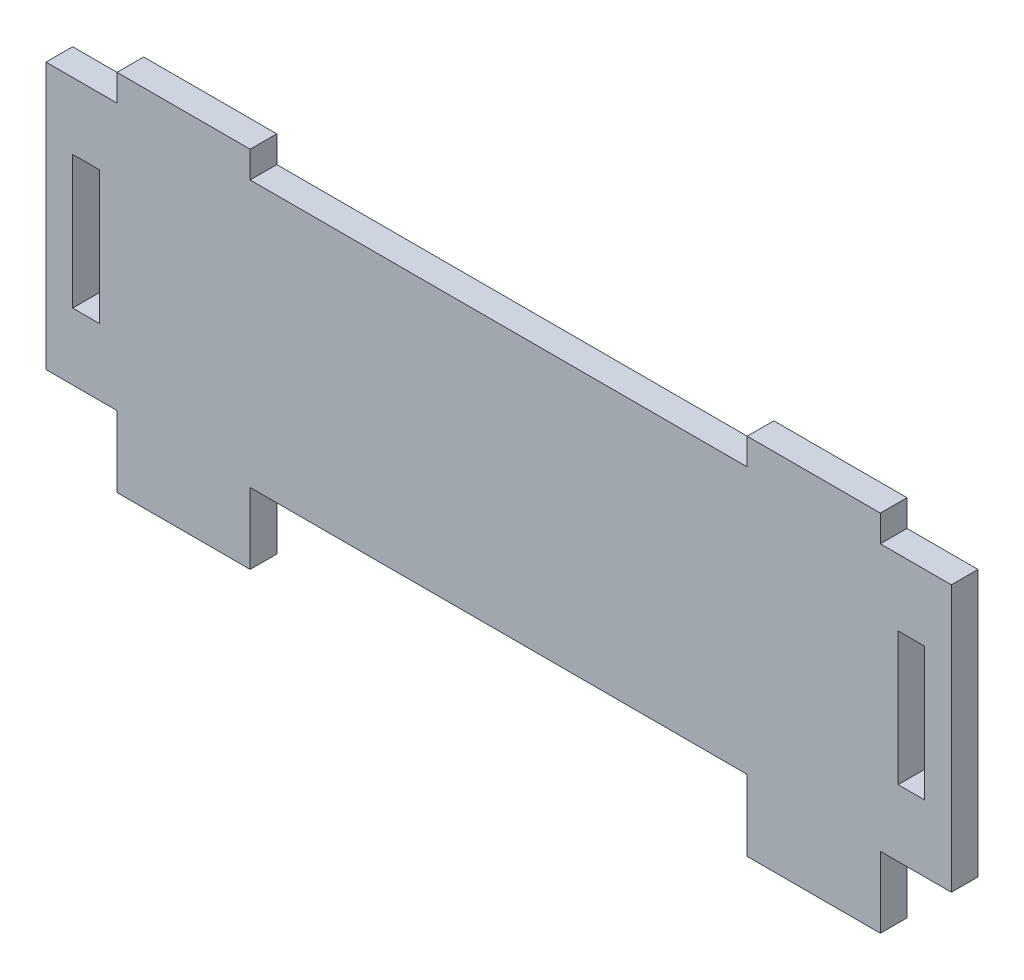
ISO-10303-21;
HEADER;
FILE_DESCRIPTION(('STEP AP214'),'2;1');
FILE_NAME('part.step','',(''),(''),'','','');
FILE_SCHEMA(('AUTOMOTIVE_DESIGN { 1 0 10303 214 1 1 1 1 }'));
ENDSEC;
DATA;
#1=APPLICATION_CONTEXT('core data for automotive mechanical design processes');
#2=APPLICATION_PROTOCOL_DEFINITION('international standard','automotive_design',2000,#1);
#3=PRODUCT_CONTEXT('',#1,'mechanical');
#4=PRODUCT('Part','Part','',(#3));
#5=PRODUCT_RELATED_PRODUCT_CATEGORY('part','',(#4));
#6=PRODUCT_DEFINITION_FORMATION('','',#4);
#7=PRODUCT_DEFINITION_CONTEXT('part definition',#1,'design');
#8=PRODUCT_DEFINITION('design','',#6,#7);
#9=PRODUCT_DEFINITION_SHAPE('','',#8);
#10=(LENGTH_UNIT() NAMED_UNIT(*) SI_UNIT(.MILLI.,.METRE.));
#11=(NAMED_UNIT(*) PLANE_ANGLE_UNIT() SI_UNIT($,.RADIAN.));
#12=(NAMED_UNIT(*) SI_UNIT($,.STERADIAN.) SOLID_ANGLE_UNIT());
#13=UNCERTAINTY_MEASURE_WITH_UNIT(LENGTH_MEASURE(1.E-05),#10,'distance_accuracy_value','');
#14=(GEOMETRIC_REPRESENTATION_CONTEXT(3) GLOBAL_UNCERTAINTY_ASSIGNED_CONTEXT((#13)) GLOBAL_UNIT_ASSIGNED_CONTEXT((#10,
#11,#12)) REPRESENTATION_CONTEXT('',''));
#15=CARTESIAN_POINT('',(0.,0.,0.));
#16=DIRECTION('',(0.,0.,1.));
#17=DIRECTION('',(1.,0.,0.));
#18=AXIS2_PLACEMENT_3D('',#15,#16,#17);
#19=CARTESIAN_POINT('',(-43.,-15.,3.));
#20=DIRECTION('',(0.,-1.,0.));
#21=DIRECTION('',(0.,0.,-1.));
#22=AXIS2_PLACEMENT_3D('',#19,#20,#21);
#23=PLANE('',#22);
#24=DIRECTION('',(-1.,0.,0.));
#25=VECTOR('',#24,1.);
#26=CARTESIAN_POINT('',(-43.,-15.,0.));
#27=LINE('',#26,#25);
#28=CARTESIAN_POINT('',(-43.,-15.,0.));
#29=VERTEX_POINT('',#28);
#30=CARTESIAN_POINT('',(-51.,-15.,0.));
#31=VERTEX_POINT('',#30);
#32=EDGE_CURVE('E420',#29,#31,#27,.T.);
#33=ORIENTED_EDGE('',*,*,#32,.F.);
#34=DIRECTION('',(0.,0.,-1.));
#35=VECTOR('',#34,1.);
#36=CARTESIAN_POINT('',(-43.,-15.,3.));
#37=LINE('',#36,#35);
#38=CARTESIAN_POINT('',(-43.,-15.,3.));
#39=VERTEX_POINT('',#38);
#40=EDGE_CURVE('E12',#39,#29,#37,.T.);
#41=ORIENTED_EDGE('',*,*,#40,.F.);
#42=DIRECTION('',(-1.,0.,0.));
#43=VECTOR('',#42,1.);
#44=CARTESIAN_POINT('',(-43.,-15.,3.));
#45=LINE('',#44,#43);
#46=CARTESIAN_POINT('',(-51.,-15.,3.));
#47=VERTEX_POINT('',#46);
#48=EDGE_CURVE('E427',#39,#47,#45,.T.);
#49=ORIENTED_EDGE('',*,*,#48,.T.);
#50=DIRECTION('',(0.,0.,-1.));
#51=VECTOR('',#50,1.);
#52=CARTESIAN_POINT('',(-51.,-15.,3.));
#53=LINE('',#52,#51);
#54=EDGE_CURVE('E179',#47,#31,#53,.T.);
#55=ORIENTED_EDGE('',*,*,#54,.T.);
#56=EDGE_LOOP('',(#33,#41,#49,#55));
#57=FACE_BOUND('',#56,.T.);
#58=ADVANCED_FACE('F176',(#57),#23,.T.);
#59=CARTESIAN_POINT('',(-43.,-23.,3.));
#60=DIRECTION('',(-1.,0.,0.));
#61=DIRECTION('',(0.,0.,1.));
#62=AXIS2_PLACEMENT_3D('',#59,#60,#61);
#63=PLANE('',#62);
#64=DIRECTION('',(0.,1.,0.));
#65=VECTOR('',#64,1.);
#66=CARTESIAN_POINT('',(-43.,-23.,0.));
#67=LINE('',#66,#65);
#68=CARTESIAN_POINT('',(-43.,-23.,0.));
#69=VERTEX_POINT('',#68);
#70=EDGE_CURVE('E431',#69,#29,#67,.T.);
#71=ORIENTED_EDGE('',*,*,#70,.F.);
#72=DIRECTION('',(0.,0.,-1.));
#73=VECTOR('',#72,1.);
#74=CARTESIAN_POINT('',(-43.,-23.,3.));
#75=LINE('',#74,#73);
#76=CARTESIAN_POINT('',(-43.,-23.,3.));
#77=VERTEX_POINT('',#76);
#78=EDGE_CURVE('E184',#77,#69,#75,.T.);
#79=ORIENTED_EDGE('',*,*,#78,.F.);
#80=DIRECTION('',(0.,1.,0.));
#81=VECTOR('',#80,1.);
#82=CARTESIAN_POINT('',(-43.,-23.,3.));
#83=LINE('',#82,#81);
#84=EDGE_CURVE('E483',#77,#39,#83,.T.);
#85=ORIENTED_EDGE('',*,*,#84,.T.);
#86=ORIENTED_EDGE('',*,*,#40,.T.);
#87=EDGE_LOOP('',(#71,#79,#85,#86));
#88=FACE_BOUND('',#87,.T.);
#89=ADVANCED_FACE('F590',(#88),#63,.T.);
#90=CARTESIAN_POINT('',(-43.,-23.,3.));
#91=DIRECTION('',(0.,1.,0.));
#92=DIRECTION('',(0.,0.,1.));
#93=AXIS2_PLACEMENT_3D('',#90,#91,#92);
#94=PLANE('',#93);
#95=DIRECTION('',(1.,0.,0.));
#96=VECTOR('',#95,1.);
#97=CARTESIAN_POINT('',(-43.,-23.,0.));
#98=LINE('',#97,#96);
#99=CARTESIAN_POINT('',(-28.,-23.,0.));
#100=VERTEX_POINT('',#99);
#101=EDGE_CURVE('E539',#69,#100,#98,.T.);
#102=ORIENTED_EDGE('',*,*,#101,.T.);
#103=DIRECTION('',(0.,0.,-1.));
#104=VECTOR('',#103,1.);
#105=CARTESIAN_POINT('',(-28.,-23.,3.));
#106=LINE('',#105,#104);
#107=CARTESIAN_POINT('',(-28.,-23.,3.));
#108=VERTEX_POINT('',#107);
#109=EDGE_CURVE('E545',#108,#100,#106,.T.);
#110=ORIENTED_EDGE('',*,*,#109,.F.);
#111=DIRECTION('',(1.,0.,0.));
#112=VECTOR('',#111,1.);
#113=CARTESIAN_POINT('',(-43.,-23.,3.));
#114=LINE('',#113,#112);
#115=EDGE_CURVE('E481',#77,#108,#114,.T.);
#116=ORIENTED_EDGE('',*,*,#115,.F.);
#117=ORIENTED_EDGE('',*,*,#78,.T.);
#118=EDGE_LOOP('',(#102,#110,#116,#117));
#119=FACE_BOUND('',#118,.T.);
#120=ADVANCED_FACE('F660',(#119),#94,.F.);
#121=CARTESIAN_POINT('',(-28.,-15.,3.));
#122=DIRECTION('',(1.,0.,0.));
#123=DIRECTION('',(0.,1.,0.));
#124=AXIS2_PLACEMENT_3D('',#121,#122,#123);
#125=PLANE('',#124);
#126=DIRECTION('',(0.,-1.,0.));
#127=VECTOR('',#126,1.);
#128=CARTESIAN_POINT('',(-28.,-15.,0.));
#129=LINE('',#128,#127);
#130=CARTESIAN_POINT('',(-28.,-15.,0.));
#131=VERTEX_POINT('',#130);
#132=EDGE_CURVE('E536',#131,#100,#129,.T.);
#133=ORIENTED_EDGE('',*,*,#132,.F.);
#134=DIRECTION('',(0.,0.,-1.));
#135=VECTOR('',#134,1.);
#136=CARTESIAN_POINT('',(-28.,-15.,3.));
#137=LINE('',#136,#135);
#138=CARTESIAN_POINT('',(-28.,-15.,3.));
#139=VERTEX_POINT('',#138);
#140=EDGE_CURVE('E547',#139,#131,#137,.T.);
#141=ORIENTED_EDGE('',*,*,#140,.F.);
#142=DIRECTION('',(0.,-1.,0.));
#143=VECTOR('',#142,1.);
#144=CARTESIAN_POINT('',(-28.,-15.,3.));
#145=LINE('',#144,#143);
#146=EDGE_CURVE('E478',#139,#108,#145,.T.);
#147=ORIENTED_EDGE('',*,*,#146,.T.);
#148=ORIENTED_EDGE('',*,*,#109,.T.);
#149=EDGE_LOOP('',(#133,#141,#147,#148));
#150=FACE_BOUND('',#149,.T.);
#151=ADVANCED_FACE('F656',(#150),#125,.T.);
#152=CARTESIAN_POINT('',(28.,-15.,3.));
#153=DIRECTION('',(0.,-1.,0.));
#154=DIRECTION('',(1.,0.,0.));
#155=AXIS2_PLACEMENT_3D('',#152,#153,#154);
#156=PLANE('',#155);
#157=DIRECTION('',(-1.,0.,0.));
#158=VECTOR('',#157,1.);
#159=CARTESIAN_POINT('',(28.,-15.,0.));
#160=LINE('',#159,#158);
#161=CARTESIAN_POINT('',(28.,-15.,0.));
#162=VERTEX_POINT('',#161);
#163=EDGE_CURVE('E533',#162,#131,#160,.T.);
#164=ORIENTED_EDGE('',*,*,#163,.F.);
#165=DIRECTION('',(0.,0.,-1.));
#166=VECTOR('',#165,1.);
#167=CARTESIAN_POINT('',(28.,-15.,3.));
#168=LINE('',#167,#166);
#169=CARTESIAN_POINT('',(28.,-15.,3.));
#170=VERTEX_POINT('',#169);
#171=EDGE_CURVE('E549',#170,#162,#168,.T.);
#172=ORIENTED_EDGE('',*,*,#171,.F.);
#173=DIRECTION('',(-1.,0.,0.));
#174=VECTOR('',#173,1.);
#175=CARTESIAN_POINT('',(28.,-15.,3.));
#176=LINE('',#175,#174);
#177=EDGE_CURVE('E475',#170,#139,#176,.T.);
#178=ORIENTED_EDGE('',*,*,#177,.T.);
#179=ORIENTED_EDGE('',*,*,#140,.T.);
#180=EDGE_LOOP('',(#164,#172,#178,#179));
#181=FACE_BOUND('',#180,.T.);
#182=ADVANCED_FACE('F653',(#181),#156,.T.);
#183=CARTESIAN_POINT('',(28.,-23.,3.));
#184=DIRECTION('',(-1.,0.,0.));
#185=DIRECTION('',(0.,0.,1.));
#186=AXIS2_PLACEMENT_3D('',#183,#184,#185);
#187=PLANE('',#186);
#188=DIRECTION('',(0.,1.,0.));
#189=VECTOR('',#188,1.);
#190=CARTESIAN_POINT('',(28.,-23.,0.));
#191=LINE('',#190,#189);
#192=CARTESIAN_POINT('',(28.,-23.,0.));
#193=VERTEX_POINT('',#192);
#194=EDGE_CURVE('E530',#193,#162,#191,.T.);
#195=ORIENTED_EDGE('',*,*,#194,.F.);
#196=DIRECTION('',(0.,0.,-1.));
#197=VECTOR('',#196,1.);
#198=CARTESIAN_POINT('',(28.,-23.,3.));
#199=LINE('',#198,#197);
#200=CARTESIAN_POINT('',(28.,-23.,3.));
#201=VERTEX_POINT('',#200);
#202=EDGE_CURVE('E551',#201,#193,#199,.T.);
#203=ORIENTED_EDGE('',*,*,#202,.F.);
#204=DIRECTION('',(0.,1.,0.));
#205=VECTOR('',#204,1.);
#206=CARTESIAN_POINT('',(28.,-23.,3.));
#207=LINE('',#206,#205);
#208=EDGE_CURVE('E472',#201,#170,#207,.T.);
#209=ORIENTED_EDGE('',*,*,#208,.T.);
#210=ORIENTED_EDGE('',*,*,#171,.T.);
#211=EDGE_LOOP('',(#195,#203,#209,#210));
#212=FACE_BOUND('',#211,.T.);
#213=ADVANCED_FACE('F649',(#212),#187,.T.);
#214=CARTESIAN_POINT('',(43.,-23.,3.));
#215=DIRECTION('',(0.,-1.,0.));
#216=DIRECTION('',(0.,0.,-1.));
#217=AXIS2_PLACEMENT_3D('',#214,#215,#216);
#218=PLANE('',#217);
#219=DIRECTION('',(-1.,0.,0.));
#220=VECTOR('',#219,1.);
#221=CARTESIAN_POINT('',(43.,-23.,0.));
#222=LINE('',#221,#220);
#223=CARTESIAN_POINT('',(43.,-23.,0.));
#224=VERTEX_POINT('',#223);
#225=EDGE_CURVE('E527',#224,#193,#222,.T.);
#226=ORIENTED_EDGE('',*,*,#225,.F.);
#227=DIRECTION('',(0.,0.,-1.));
#228=VECTOR('',#227,1.);
#229=CARTESIAN_POINT('',(43.,-23.,3.));
#230=LINE('',#229,#228);
#231=CARTESIAN_POINT('',(43.,-23.,3.));
#232=VERTEX_POINT('',#231);
#233=EDGE_CURVE('E553',#232,#224,#230,.T.);
#234=ORIENTED_EDGE('',*,*,#233,.F.);
#235=DIRECTION('',(-1.,0.,0.));
#236=VECTOR('',#235,1.);
#237=CARTESIAN_POINT('',(43.,-23.,3.));
#238=LINE('',#237,#236);
#239=EDGE_CURVE('E469',#232,#201,#238,.T.);
#240=ORIENTED_EDGE('',*,*,#239,.T.);
#241=ORIENTED_EDGE('',*,*,#202,.T.);
#242=EDGE_LOOP('',(#226,#234,#240,#241));
#243=FACE_BOUND('',#242,.T.);
#244=ADVANCED_FACE('F645',(#243),#218,.T.);
#245=CARTESIAN_POINT('',(43.,-15.,3.));
#246=DIRECTION('',(1.,0.,0.));
#247=DIRECTION('',(0.,0.,-1.));
#248=AXIS2_PLACEMENT_3D('',#245,#246,#247);
#249=PLANE('',#248);
#250=DIRECTION('',(0.,-1.,0.));
#251=VECTOR('',#250,1.);
#252=CARTESIAN_POINT('',(43.,-15.,0.));
#253=LINE('',#252,#251);
#254=CARTESIAN_POINT('',(43.,-15.,0.));
#255=VERTEX_POINT('',#254);
#256=EDGE_CURVE('E524',#255,#224,#253,.T.);
#257=ORIENTED_EDGE('',*,*,#256,.F.);
#258=DIRECTION('',(0.,0.,-1.));
#259=VECTOR('',#258,1.);
#260=CARTESIAN_POINT('',(43.,-15.,3.));
#261=LINE('',#260,#259);
#262=CARTESIAN_POINT('',(43.,-15.,3.));
#263=VERTEX_POINT('',#262);
#264=EDGE_CURVE('E555',#263,#255,#261,.T.);
#265=ORIENTED_EDGE('',*,*,#264,.F.);
#266=DIRECTION('',(0.,-1.,0.));
#267=VECTOR('',#266,1.);
#268=CARTESIAN_POINT('',(43.,-15.,3.));
#269=LINE('',#268,#267);
#270=EDGE_CURVE('E466',#263,#232,#269,.T.);
#271=ORIENTED_EDGE('',*,*,#270,.T.);
#272=ORIENTED_EDGE('',*,*,#233,.T.);
#273=EDGE_LOOP('',(#257,#265,#271,#272));
#274=FACE_BOUND('',#273,.T.);
#275=ADVANCED_FACE('F641',(#274),#249,.T.);
#276=CARTESIAN_POINT('',(51.,-15.,3.));
#277=DIRECTION('',(0.,-1.,0.));
#278=DIRECTION('',(1.,0.,0.));
#279=AXIS2_PLACEMENT_3D('',#276,#277,#278);
#280=PLANE('',#279);
#281=DIRECTION('',(-1.,0.,0.));
#282=VECTOR('',#281,1.);
#283=CARTESIAN_POINT('',(51.,-15.,0.));
#284=LINE('',#283,#282);
#285=CARTESIAN_POINT('',(51.,-15.,0.));
#286=VERTEX_POINT('',#285);
#287=EDGE_CURVE('E521',#286,#255,#284,.T.);
#288=ORIENTED_EDGE('',*,*,#287,.F.);
#289=DIRECTION('',(0.,0.,-1.));
#290=VECTOR('',#289,1.);
#291=CARTESIAN_POINT('',(51.,-15.,3.));
#292=LINE('',#291,#290);
#293=CARTESIAN_POINT('',(51.,-15.,3.));
#294=VERTEX_POINT('',#293);
#295=EDGE_CURVE('E557',#294,#286,#292,.T.);
#296=ORIENTED_EDGE('',*,*,#295,.F.);
#297=DIRECTION('',(-1.,0.,0.));
#298=VECTOR('',#297,1.);
#299=CARTESIAN_POINT('',(51.,-15.,3.));
#300=LINE('',#299,#298);
#301=EDGE_CURVE('E463',#294,#263,#300,.T.);
#302=ORIENTED_EDGE('',*,*,#301,.T.);
#303=ORIENTED_EDGE('',*,*,#264,.T.);
#304=EDGE_LOOP('',(#288,#296,#302,#303));
#305=FACE_BOUND('',#304,.T.);
#306=ADVANCED_FACE('F636',(#305),#280,.T.);
#307=CARTESIAN_POINT('',(51.,-15.,3.));
#308=DIRECTION('',(-1.,0.,0.));
#309=DIRECTION('',(0.,0.,1.));
#310=AXIS2_PLACEMENT_3D('',#307,#308,#309);
#311=PLANE('',#310);
#312=DIRECTION('',(0.,1.,0.));
#313=VECTOR('',#312,1.);
#314=CARTESIAN_POINT('',(51.,-15.,0.));
#315=LINE('',#314,#313);
#316=CARTESIAN_POINT('',(51.,15.,0.));
#317=VERTEX_POINT('',#316);
#318=EDGE_CURVE('E518',#286,#317,#315,.T.);
#319=ORIENTED_EDGE('',*,*,#318,.T.);
#320=DIRECTION('',(0.,0.,-1.));
#321=VECTOR('',#320,1.);
#322=CARTESIAN_POINT('',(51.,15.,3.));
#323=LINE('',#322,#321);
#324=CARTESIAN_POINT('',(51.,15.,3.));
#325=VERTEX_POINT('',#324);
#326=EDGE_CURVE('E559',#325,#317,#323,.T.);
#327=ORIENTED_EDGE('',*,*,#326,.F.);
#328=DIRECTION('',(0.,1.,0.));
#329=VECTOR('',#328,1.);
#330=CARTESIAN_POINT('',(51.,-15.,3.));
#331=LINE('',#330,#329);
#332=EDGE_CURVE('E461',#294,#325,#331,.T.);
#333=ORIENTED_EDGE('',*,*,#332,.F.);
#334=ORIENTED_EDGE('',*,*,#295,.T.);
#335=EDGE_LOOP('',(#319,#327,#333,#334));
#336=FACE_BOUND('',#335,.T.);
#337=ADVANCED_FACE('F633',(#336),#311,.F.);
#338=CARTESIAN_POINT('',(43.,15.,3.));
#339=DIRECTION('',(0.,1.,0.));
#340=DIRECTION('',(-1.,0.,0.));
#341=AXIS2_PLACEMENT_3D('',#338,#339,#340);
#342=PLANE('',#341);
#343=DIRECTION('',(1.,0.,0.));
#344=VECTOR('',#343,1.);
#345=CARTESIAN_POINT('',(43.,15.,0.));
#346=LINE('',#345,#344);
#347=CARTESIAN_POINT('',(43.,15.,0.));
#348=VERTEX_POINT('',#347);
#349=EDGE_CURVE('E515',#348,#317,#346,.T.);
#350=ORIENTED_EDGE('',*,*,#349,.F.);
#351=DIRECTION('',(0.,0.,-1.));
#352=VECTOR('',#351,1.);
#353=CARTESIAN_POINT('',(43.,15.,3.));
#354=LINE('',#353,#352);
#355=CARTESIAN_POINT('',(43.,15.,3.));
#356=VERTEX_POINT('',#355);
#357=EDGE_CURVE('E561',#356,#348,#354,.T.);
#358=ORIENTED_EDGE('',*,*,#357,.F.);
#359=DIRECTION('',(1.,0.,0.));
#360=VECTOR('',#359,1.);
#361=CARTESIAN_POINT('',(43.,15.,3.));
#362=LINE('',#361,#360);
#363=EDGE_CURVE('E458',#356,#325,#362,.T.);
#364=ORIENTED_EDGE('',*,*,#363,.T.);
#365=ORIENTED_EDGE('',*,*,#326,.T.);
#366=EDGE_LOOP('',(#350,#358,#364,#365));
#367=FACE_BOUND('',#366,.T.);
#368=ADVANCED_FACE('F629',(#367),#342,.T.);
#369=CARTESIAN_POINT('',(43.,18.,3.));
#370=DIRECTION('',(1.,0.,0.));
#371=DIRECTION('',(0.,0.,-1.));
#372=AXIS2_PLACEMENT_3D('',#369,#370,#371);
#373=PLANE('',#372);
#374=DIRECTION('',(0.,-1.,0.));
#375=VECTOR('',#374,1.);
#376=CARTESIAN_POINT('',(43.,18.,0.));
#377=LINE('',#376,#375);
#378=CARTESIAN_POINT('',(43.,18.,0.));
#379=VERTEX_POINT('',#378);
#380=EDGE_CURVE('E512',#379,#348,#377,.T.);
#381=ORIENTED_EDGE('',*,*,#380,.F.);
#382=DIRECTION('',(0.,0.,-1.));
#383=VECTOR('',#382,1.);
#384=CARTESIAN_POINT('',(43.,18.,3.));
#385=LINE('',#384,#383);
#386=CARTESIAN_POINT('',(43.,18.,3.));
#387=VERTEX_POINT('',#386);
#388=EDGE_CURVE('E563',#387,#379,#385,.T.);
#389=ORIENTED_EDGE('',*,*,#388,.F.);
#390=DIRECTION('',(0.,-1.,0.));
#391=VECTOR('',#390,1.);
#392=CARTESIAN_POINT('',(43.,18.,3.));
#393=LINE('',#392,#391);
#394=EDGE_CURVE('E455',#387,#356,#393,.T.);
#395=ORIENTED_EDGE('',*,*,#394,.T.);
#396=ORIENTED_EDGE('',*,*,#357,.T.);
#397=EDGE_LOOP('',(#381,#389,#395,#396));
#398=FACE_BOUND('',#397,.T.);
#399=ADVANCED_FACE('F625',(#398),#373,.T.);
#400=CARTESIAN_POINT('',(28.,18.,3.));
#401=DIRECTION('',(0.,1.,0.));
#402=DIRECTION('',(0.,0.,1.));
#403=AXIS2_PLACEMENT_3D('',#400,#401,#402);
#404=PLANE('',#403);
#405=DIRECTION('',(1.,0.,0.));
#406=VECTOR('',#405,1.);
#407=CARTESIAN_POINT('',(28.,18.,0.));
#408=LINE('',#407,#406);
#409=CARTESIAN_POINT('',(28.,18.,0.));
#410=VERTEX_POINT('',#409);
#411=EDGE_CURVE('E509',#410,#379,#408,.T.);
#412=ORIENTED_EDGE('',*,*,#411,.F.);
#413=DIRECTION('',(0.,0.,-1.));
#414=VECTOR('',#413,1.);
#415=CARTESIAN_POINT('',(28.,18.,3.));
#416=LINE('',#415,#414);
#417=CARTESIAN_POINT('',(28.,18.,3.));
#418=VERTEX_POINT('',#417);
#419=EDGE_CURVE('E565',#418,#410,#416,.T.);
#420=ORIENTED_EDGE('',*,*,#419,.F.);
#421=DIRECTION('',(1.,0.,0.));
#422=VECTOR('',#421,1.);
#423=CARTESIAN_POINT('',(28.,18.,3.));
#424=LINE('',#423,#422);
#425=EDGE_CURVE('E452',#418,#387,#424,.T.);
#426=ORIENTED_EDGE('',*,*,#425,.T.);
#427=ORIENTED_EDGE('',*,*,#388,.T.);
#428=EDGE_LOOP('',(#412,#420,#426,#427));
#429=FACE_BOUND('',#428,.T.);
#430=ADVANCED_FACE('F620',(#429),#404,.T.);
#431=CARTESIAN_POINT('',(28.,15.,3.));
#432=DIRECTION('',(-1.,0.,0.));
#433=DIRECTION('',(0.,0.,1.));
#434=AXIS2_PLACEMENT_3D('',#431,#432,#433);
#435=PLANE('',#434);
#436=DIRECTION('',(0.,1.,0.));
#437=VECTOR('',#436,1.);
#438=CARTESIAN_POINT('',(28.,15.,0.));
#439=LINE('',#438,#437);
#440=CARTESIAN_POINT('',(28.,15.,0.));
#441=VERTEX_POINT('',#440);
#442=EDGE_CURVE('E506',#441,#410,#439,.T.);
#443=ORIENTED_EDGE('',*,*,#442,.F.);
#444=DIRECTION('',(0.,0.,-1.));
#445=VECTOR('',#444,1.);
#446=CARTESIAN_POINT('',(28.,15.,3.));
#447=LINE('',#446,#445);
#448=CARTESIAN_POINT('',(28.,15.,3.));
#449=VERTEX_POINT('',#448);
#450=EDGE_CURVE('E567',#449,#441,#447,.T.);
#451=ORIENTED_EDGE('',*,*,#450,.F.);
#452=DIRECTION('',(0.,1.,0.));
#453=VECTOR('',#452,1.);
#454=CARTESIAN_POINT('',(28.,15.,3.));
#455=LINE('',#454,#453);
#456=EDGE_CURVE('E449',#449,#418,#455,.T.);
#457=ORIENTED_EDGE('',*,*,#456,.T.);
#458=ORIENTED_EDGE('',*,*,#419,.T.);
#459=EDGE_LOOP('',(#443,#451,#457,#458));
#460=FACE_BOUND('',#459,.T.);
#461=ADVANCED_FACE('F616',(#460),#435,.T.);
#462=CARTESIAN_POINT('',(-28.,15.,3.));
#463=DIRECTION('',(0.,1.,0.));
#464=DIRECTION('',(0.,0.,1.));
#465=AXIS2_PLACEMENT_3D('',#462,#463,#464);
#466=PLANE('',#465);
#467=DIRECTION('',(1.,0.,0.));
#468=VECTOR('',#467,1.);
#469=CARTESIAN_POINT('',(-28.,15.,0.));
#470=LINE('',#469,#468);
#471=CARTESIAN_POINT('',(-28.,15.,0.));
#472=VERTEX_POINT('',#471);
#473=EDGE_CURVE('E503',#472,#441,#470,.T.);
#474=ORIENTED_EDGE('',*,*,#473,.F.);
#475=DIRECTION('',(0.,0.,-1.));
#476=VECTOR('',#475,1.);
#477=CARTESIAN_POINT('',(-28.,15.,3.));
#478=LINE('',#477,#476);
#479=CARTESIAN_POINT('',(-28.,15.,3.));
#480=VERTEX_POINT('',#479);
#481=EDGE_CURVE('E569',#480,#472,#478,.T.);
#482=ORIENTED_EDGE('',*,*,#481,.F.);
#483=DIRECTION('',(1.,0.,0.));
#484=VECTOR('',#483,1.);
#485=CARTESIAN_POINT('',(-28.,15.,3.));
#486=LINE('',#485,#484);
#487=EDGE_CURVE('E446',#480,#449,#486,.T.);
#488=ORIENTED_EDGE('',*,*,#487,.T.);
#489=ORIENTED_EDGE('',*,*,#450,.T.);
#490=EDGE_LOOP('',(#474,#482,#488,#489));
#491=FACE_BOUND('',#490,.T.);
#492=ADVANCED_FACE('F612',(#491),#466,.T.);
#493=CARTESIAN_POINT('',(-28.,18.,3.));
#494=DIRECTION('',(1.,0.,0.));
#495=DIRECTION('',(0.,0.,-1.));
#496=AXIS2_PLACEMENT_3D('',#493,#494,#495);
#497=PLANE('',#496);
#498=DIRECTION('',(0.,-1.,0.));
#499=VECTOR('',#498,1.);
#500=CARTESIAN_POINT('',(-28.,18.,0.));
#501=LINE('',#500,#499);
#502=CARTESIAN_POINT('',(-28.,18.,0.));
#503=VERTEX_POINT('',#502);
#504=EDGE_CURVE('E500',#503,#472,#501,.T.);
#505=ORIENTED_EDGE('',*,*,#504,.F.);
#506=DIRECTION('',(0.,0.,-1.));
#507=VECTOR('',#506,1.);
#508=CARTESIAN_POINT('',(-28.,18.,3.));
#509=LINE('',#508,#507);
#510=CARTESIAN_POINT('',(-28.,18.,3.));
#511=VERTEX_POINT('',#510);
#512=EDGE_CURVE('E571',#511,#503,#509,.T.);
#513=ORIENTED_EDGE('',*,*,#512,.F.);
#514=DIRECTION('',(0.,-1.,0.));
#515=VECTOR('',#514,1.);
#516=CARTESIAN_POINT('',(-28.,18.,3.));
#517=LINE('',#516,#515);
#518=EDGE_CURVE('E443',#511,#480,#517,.T.);
#519=ORIENTED_EDGE('',*,*,#518,.T.);
#520=ORIENTED_EDGE('',*,*,#481,.T.);
#521=EDGE_LOOP('',(#505,#513,#519,#520));
#522=FACE_BOUND('',#521,.T.);
#523=ADVANCED_FACE('F608',(#522),#497,.T.);
#524=CARTESIAN_POINT('',(-43.,18.,3.));
#525=DIRECTION('',(0.,1.,0.));
#526=DIRECTION('',(0.,0.,1.));
#527=AXIS2_PLACEMENT_3D('',#524,#525,#526);
#528=PLANE('',#527);
#529=DIRECTION('',(1.,0.,0.));
#530=VECTOR('',#529,1.);
#531=CARTESIAN_POINT('',(-43.,18.,0.));
#532=LINE('',#531,#530);
#533=CARTESIAN_POINT('',(-43.,18.,0.));
#534=VERTEX_POINT('',#533);
#535=EDGE_CURVE('E497',#534,#503,#532,.T.);
#536=ORIENTED_EDGE('',*,*,#535,.F.);
#537=DIRECTION('',(0.,0.,-1.));
#538=VECTOR('',#537,1.);
#539=CARTESIAN_POINT('',(-43.,18.,3.));
#540=LINE('',#539,#538);
#541=CARTESIAN_POINT('',(-43.,18.,3.));
#542=VERTEX_POINT('',#541);
#543=EDGE_CURVE('E573',#542,#534,#540,.T.);
#544=ORIENTED_EDGE('',*,*,#543,.F.);
#545=DIRECTION('',(1.,0.,0.));
#546=VECTOR('',#545,1.);
#547=CARTESIAN_POINT('',(-43.,18.,3.));
#548=LINE('',#547,#546);
#549=EDGE_CURVE('E440',#542,#511,#548,.T.);
#550=ORIENTED_EDGE('',*,*,#549,.T.);
#551=ORIENTED_EDGE('',*,*,#512,.T.);
#552=EDGE_LOOP('',(#536,#544,#550,#551));
#553=FACE_BOUND('',#552,.T.);
#554=ADVANCED_FACE('F604',(#553),#528,.T.);
#555=CARTESIAN_POINT('',(-43.,15.,3.));
#556=DIRECTION('',(-1.,0.,0.));
#557=DIRECTION('',(0.,0.,1.));
#558=AXIS2_PLACEMENT_3D('',#555,#556,#557);
#559=PLANE('',#558);
#560=DIRECTION('',(0.,1.,0.));
#561=VECTOR('',#560,1.);
#562=CARTESIAN_POINT('',(-43.,15.,0.));
#563=LINE('',#562,#561);
#564=CARTESIAN_POINT('',(-43.,15.,0.));
#565=VERTEX_POINT('',#564);
#566=EDGE_CURVE('E494',#565,#534,#563,.T.);
#567=ORIENTED_EDGE('',*,*,#566,.F.);
#568=DIRECTION('',(0.,0.,-1.));
#569=VECTOR('',#568,1.);
#570=CARTESIAN_POINT('',(-43.,15.,3.));
#571=LINE('',#570,#569);
#572=CARTESIAN_POINT('',(-43.,15.,3.));
#573=VERTEX_POINT('',#572);
#574=EDGE_CURVE('E575',#573,#565,#571,.T.);
#575=ORIENTED_EDGE('',*,*,#574,.F.);
#576=DIRECTION('',(0.,1.,0.));
#577=VECTOR('',#576,1.);
#578=CARTESIAN_POINT('',(-43.,15.,3.));
#579=LINE('',#578,#577);
#580=EDGE_CURVE('E437',#573,#542,#579,.T.);
#581=ORIENTED_EDGE('',*,*,#580,.T.);
#582=ORIENTED_EDGE('',*,*,#543,.T.);
#583=EDGE_LOOP('',(#567,#575,#581,#582));
#584=FACE_BOUND('',#583,.T.);
#585=ADVANCED_FACE('F602',(#584),#559,.T.);
#586=CARTESIAN_POINT('',(-51.,15.,3.));
#587=DIRECTION('',(0.,1.,0.));
#588=DIRECTION('',(0.,0.,1.));
#589=AXIS2_PLACEMENT_3D('',#586,#587,#588);
#590=PLANE('',#589);
#591=DIRECTION('',(1.,0.,0.));
#592=VECTOR('',#591,1.);
#593=CARTESIAN_POINT('',(-51.,15.,0.));
#594=LINE('',#593,#592);
#595=CARTESIAN_POINT('',(-51.,15.,0.));
#596=VERTEX_POINT('',#595);
#597=EDGE_CURVE('E491',#596,#565,#594,.T.);
#598=ORIENTED_EDGE('',*,*,#597,.F.);
#599=DIRECTION('',(0.,0.,-1.));
#600=VECTOR('',#599,1.);
#601=CARTESIAN_POINT('',(-51.,15.,3.));
#602=LINE('',#601,#600);
#603=CARTESIAN_POINT('',(-51.,15.,3.));
#604=VERTEX_POINT('',#603);
#605=EDGE_CURVE('E576',#604,#596,#602,.T.);
#606=ORIENTED_EDGE('',*,*,#605,.F.);
#607=DIRECTION('',(1.,0.,0.));
#608=VECTOR('',#607,1.);
#609=CARTESIAN_POINT('',(-51.,15.,3.));
#610=LINE('',#609,#608);
#611=EDGE_CURVE('E434',#604,#573,#610,.T.);
#612=ORIENTED_EDGE('',*,*,#611,.T.);
#613=ORIENTED_EDGE('',*,*,#574,.T.);
#614=EDGE_LOOP('',(#598,#606,#612,#613));
#615=FACE_BOUND('',#614,.T.);
#616=ADVANCED_FACE('F598',(#615),#590,.T.);
#617=CARTESIAN_POINT('',(-51.,-15.,3.));
#618=DIRECTION('',(-1.,0.,0.));
#619=DIRECTION('',(0.,0.,1.));
#620=AXIS2_PLACEMENT_3D('',#617,#618,#619);
#621=PLANE('',#620);
#622=DIRECTION('',(0.,1.,0.));
#623=VECTOR('',#622,1.);
#624=CARTESIAN_POINT('',(-51.,-15.,0.));
#625=LINE('',#624,#623);
#626=EDGE_CURVE('E488',#31,#596,#625,.T.);
#627=ORIENTED_EDGE('',*,*,#626,.F.);
#628=ORIENTED_EDGE('',*,*,#54,.F.);
#629=DIRECTION('',(0.,1.,0.));
#630=VECTOR('',#629,1.);
#631=CARTESIAN_POINT('',(-51.,-15.,3.));
#632=LINE('',#631,#630);
#633=EDGE_CURVE('E430',#47,#604,#632,.T.);
#634=ORIENTED_EDGE('',*,*,#633,.T.);
#635=ORIENTED_EDGE('',*,*,#605,.T.);
#636=EDGE_LOOP('',(#627,#628,#634,#635));
#637=FACE_BOUND('',#636,.T.);
#638=ADVANCED_FACE('F584',(#637),#621,.T.);
#639=CARTESIAN_POINT('',(0.,0.,3.));
#640=DIRECTION('',(0.,0.,-1.));
#641=DIRECTION('',(-1.,0.,0.));
#642=AXIS2_PLACEMENT_3D('',#639,#640,#641);
#643=PLANE('',#642);
#644=DIRECTION('',(0.,-1.,0.));
#645=VECTOR('',#644,1.);
#646=CARTESIAN_POINT('',(45.,7.5,3.));
#647=LINE('',#646,#645);
#648=CARTESIAN_POINT('',(45.,7.5,3.));
#649=VERTEX_POINT('',#648);
#650=CARTESIAN_POINT('',(45.,-7.5,3.));
#651=VERTEX_POINT('',#650);
#652=EDGE_CURVE('E366',#649,#651,#647,.T.);
#653=ORIENTED_EDGE('',*,*,#652,.F.);
#654=DIRECTION('',(1.,0.,0.));
#655=VECTOR('',#654,1.);
#656=CARTESIAN_POINT('',(45.,7.5,3.));
#657=LINE('',#656,#655);
#658=CARTESIAN_POINT('',(48.,7.5,3.));
#659=VERTEX_POINT('',#658);
#660=EDGE_CURVE('E363',#649,#659,#657,.T.);
#661=ORIENTED_EDGE('',*,*,#660,.T.);
#662=DIRECTION('',(0.,-1.,0.));
#663=VECTOR('',#662,1.);
#664=CARTESIAN_POINT('',(48.,7.5,3.));
#665=LINE('',#664,#663);
#666=CARTESIAN_POINT('',(48.,-7.5,3.));
#667=VERTEX_POINT('',#666);
#668=EDGE_CURVE('E369',#659,#667,#665,.T.);
#669=ORIENTED_EDGE('',*,*,#668,.T.);
#670=DIRECTION('',(1.,0.,0.));
#671=VECTOR('',#670,1.);
#672=CARTESIAN_POINT('',(45.,-7.5,3.));
#673=LINE('',#672,#671);
#674=EDGE_CURVE('E373',#651,#667,#673,.T.);
#675=ORIENTED_EDGE('',*,*,#674,.F.);
#676=EDGE_LOOP('',(#653,#661,#669,#675));
#677=FACE_BOUND('',#676,.T.);
#678=DIRECTION('',(0.,-1.,0.));
#679=VECTOR('',#678,1.);
#680=CARTESIAN_POINT('',(-48.,7.5,3.));
#681=LINE('',#680,#679);
#682=CARTESIAN_POINT('',(-48.,7.5,3.));
#683=VERTEX_POINT('',#682);
#684=CARTESIAN_POINT('',(-48.,-7.5,3.));
#685=VERTEX_POINT('',#684);
#686=EDGE_CURVE('E406',#683,#685,#681,.T.);
#687=ORIENTED_EDGE('',*,*,#686,.F.);
#688=DIRECTION('',(1.,0.,0.));
#689=VECTOR('',#688,1.);
#690=CARTESIAN_POINT('',(-48.,7.5,3.));
#691=LINE('',#690,#689);
#692=CARTESIAN_POINT('',(-45.,7.5,3.));
#693=VERTEX_POINT('',#692);
#694=EDGE_CURVE('E396',#683,#693,#691,.T.);
#695=ORIENTED_EDGE('',*,*,#694,.T.);
#696=DIRECTION('',(0.,-1.,0.));
#697=VECTOR('',#696,1.);
#698=CARTESIAN_POINT('',(-45.,7.5,3.));
#699=LINE('',#698,#697);
#700=CARTESIAN_POINT('',(-45.,-7.5,3.));
#701=VERTEX_POINT('',#700);
#702=EDGE_CURVE('E399',#693,#701,#699,.T.);
#703=ORIENTED_EDGE('',*,*,#702,.T.);
#704=DIRECTION('',(1.,0.,0.));
#705=VECTOR('',#704,1.);
#706=CARTESIAN_POINT('',(-48.,-7.5,3.));
#707=LINE('',#706,#705);
#708=EDGE_CURVE('E403',#685,#701,#707,.T.);
#709=ORIENTED_EDGE('',*,*,#708,.F.);
#710=EDGE_LOOP('',(#687,#695,#703,#709));
#711=FACE_BOUND('',#710,.T.);
#712=ORIENTED_EDGE('',*,*,#48,.F.);
#713=ORIENTED_EDGE('',*,*,#84,.F.);
#714=ORIENTED_EDGE('',*,*,#115,.T.);
#715=ORIENTED_EDGE('',*,*,#146,.F.);
#716=ORIENTED_EDGE('',*,*,#177,.F.);
#717=ORIENTED_EDGE('',*,*,#208,.F.);
#718=ORIENTED_EDGE('',*,*,#239,.F.);
#719=ORIENTED_EDGE('',*,*,#270,.F.);
#720=ORIENTED_EDGE('',*,*,#301,.F.);
#721=ORIENTED_EDGE('',*,*,#332,.T.);
#722=ORIENTED_EDGE('',*,*,#363,.F.);
#723=ORIENTED_EDGE('',*,*,#394,.F.);
#724=ORIENTED_EDGE('',*,*,#425,.F.);
#725=ORIENTED_EDGE('',*,*,#456,.F.);
#726=ORIENTED_EDGE('',*,*,#487,.F.);
#727=ORIENTED_EDGE('',*,*,#518,.F.);
#728=ORIENTED_EDGE('',*,*,#549,.F.);
#729=ORIENTED_EDGE('',*,*,#580,.F.);
#730=ORIENTED_EDGE('',*,*,#611,.F.);
#731=ORIENTED_EDGE('',*,*,#633,.F.);
#732=EDGE_LOOP('',(#712,#713,#714,#715,#716,#717,#718,#719,#720,#721,#722,#723,#724,#725,#726,
#727,#728,#729,#730,#731));
#733=FACE_BOUND('',#732,.T.);
#734=ADVANCED_FACE('F375',(#677,#711,#733),#643,.F.);
#735=CARTESIAN_POINT('',(0.,0.,0.));
#736=DIRECTION('',(0.,0.,-1.));
#737=DIRECTION('',(-1.,0.,0.));
#738=AXIS2_PLACEMENT_3D('',#735,#736,#737);
#739=PLANE('',#738);
#740=DIRECTION('',(1.,0.,0.));
#741=VECTOR('',#740,1.);
#742=CARTESIAN_POINT('',(45.,7.5,0.));
#743=LINE('',#742,#741);
#744=CARTESIAN_POINT('',(45.,7.5,0.));
#745=VERTEX_POINT('',#744);
#746=CARTESIAN_POINT('',(48.,7.5,0.));
#747=VERTEX_POINT('',#746);
#748=EDGE_CURVE('E200',#745,#747,#743,.T.);
#749=ORIENTED_EDGE('',*,*,#748,.F.);
#750=DIRECTION('',(0.,-1.,0.));
#751=VECTOR('',#750,1.);
#752=CARTESIAN_POINT('',(45.,7.5,0.));
#753=LINE('',#752,#751);
#754=CARTESIAN_POINT('',(45.,-7.5,0.));
#755=VERTEX_POINT('',#754);
#756=EDGE_CURVE('E377',#745,#755,#753,.T.);
#757=ORIENTED_EDGE('',*,*,#756,.T.);
#758=DIRECTION('',(1.,0.,0.));
#759=VECTOR('',#758,1.);
#760=CARTESIAN_POINT('',(45.,-7.5,0.));
#761=LINE('',#760,#759);
#762=CARTESIAN_POINT('',(48.,-7.5,0.));
#763=VERTEX_POINT('',#762);
#764=EDGE_CURVE('E380',#755,#763,#761,.T.);
#765=ORIENTED_EDGE('',*,*,#764,.T.);
#766=DIRECTION('',(0.,-1.,0.));
#767=VECTOR('',#766,1.);
#768=CARTESIAN_POINT('',(48.,7.5,0.));
#769=LINE('',#768,#767);
#770=EDGE_CURVE('E386',#747,#763,#769,.T.);
#771=ORIENTED_EDGE('',*,*,#770,.F.);
#772=EDGE_LOOP('',(#749,#757,#765,#771));
#773=FACE_BOUND('',#772,.T.);
#774=DIRECTION('',(1.,0.,0.));
#775=VECTOR('',#774,1.);
#776=CARTESIAN_POINT('',(-48.,7.5,0.));
#777=LINE('',#776,#775);
#778=CARTESIAN_POINT('',(-48.,7.5,0.));
#779=VERTEX_POINT('',#778);
#780=CARTESIAN_POINT('',(-45.,7.5,0.));
#781=VERTEX_POINT('',#780);
#782=EDGE_CURVE('E392',#779,#781,#777,.T.);
#783=ORIENTED_EDGE('',*,*,#782,.F.);
#784=DIRECTION('',(0.,-1.,0.));
#785=VECTOR('',#784,1.);
#786=CARTESIAN_POINT('',(-48.,7.5,0.));
#787=LINE('',#786,#785);
#788=CARTESIAN_POINT('',(-48.,-7.5,0.));
#789=VERTEX_POINT('',#788);
#790=EDGE_CURVE('E400',#779,#789,#787,.T.);
#791=ORIENTED_EDGE('',*,*,#790,.T.);
#792=DIRECTION('',(1.,0.,0.));
#793=VECTOR('',#792,1.);
#794=CARTESIAN_POINT('',(-48.,-7.5,0.));
#795=LINE('',#794,#793);
#796=CARTESIAN_POINT('',(-45.,-7.5,0.));
#797=VERTEX_POINT('',#796);
#798=EDGE_CURVE('E413',#789,#797,#795,.T.);
#799=ORIENTED_EDGE('',*,*,#798,.T.);
#800=DIRECTION('',(0.,-1.,0.));
#801=VECTOR('',#800,1.);
#802=CARTESIAN_POINT('',(-45.,7.5,0.));
#803=LINE('',#802,#801);
#804=EDGE_CURVE('E410',#781,#797,#803,.T.);
#805=ORIENTED_EDGE('',*,*,#804,.F.);
#806=EDGE_LOOP('',(#783,#791,#799,#805));
#807=FACE_BOUND('',#806,.T.);
#808=ORIENTED_EDGE('',*,*,#32,.T.);
#809=ORIENTED_EDGE('',*,*,#626,.T.);
#810=ORIENTED_EDGE('',*,*,#597,.T.);
#811=ORIENTED_EDGE('',*,*,#566,.T.);
#812=ORIENTED_EDGE('',*,*,#535,.T.);
#813=ORIENTED_EDGE('',*,*,#504,.T.);
#814=ORIENTED_EDGE('',*,*,#473,.T.);
#815=ORIENTED_EDGE('',*,*,#442,.T.);
#816=ORIENTED_EDGE('',*,*,#411,.T.);
#817=ORIENTED_EDGE('',*,*,#380,.T.);
#818=ORIENTED_EDGE('',*,*,#349,.T.);
#819=ORIENTED_EDGE('',*,*,#318,.F.);
#820=ORIENTED_EDGE('',*,*,#287,.T.);
#821=ORIENTED_EDGE('',*,*,#256,.T.);
#822=ORIENTED_EDGE('',*,*,#225,.T.);
#823=ORIENTED_EDGE('',*,*,#194,.T.);
#824=ORIENTED_EDGE('',*,*,#163,.T.);
#825=ORIENTED_EDGE('',*,*,#132,.T.);
#826=ORIENTED_EDGE('',*,*,#101,.F.);
#827=ORIENTED_EDGE('',*,*,#70,.T.);
#828=EDGE_LOOP('',(#808,#809,#810,#811,#812,#813,#814,#815,#816,#817,#818,#819,#820,#821,#822,
#823,#824,#825,#826,#827));
#829=FACE_BOUND('',#828,.T.);
#830=ADVANCED_FACE('F586',(#773,#807,#829),#739,.T.);
#831=CARTESIAN_POINT('',(-48.,7.5,3.));
#832=DIRECTION('',(0.,1.,0.));
#833=DIRECTION('',(0.,0.,1.));
#834=AXIS2_PLACEMENT_3D('',#831,#832,#833);
#835=PLANE('',#834);
#836=ORIENTED_EDGE('',*,*,#782,.T.);
#837=DIRECTION('',(0.,0.,-1.));
#838=VECTOR('',#837,1.);
#839=CARTESIAN_POINT('',(-45.,7.5,3.));
#840=LINE('',#839,#838);
#841=EDGE_CURVE('E408',#693,#781,#840,.T.);
#842=ORIENTED_EDGE('',*,*,#841,.F.);
#843=ORIENTED_EDGE('',*,*,#694,.F.);
#844=DIRECTION('',(0.,0.,-1.));
#845=VECTOR('',#844,1.);
#846=CARTESIAN_POINT('',(-48.,7.5,3.));
#847=LINE('',#846,#845);
#848=EDGE_CURVE('E418',#683,#779,#847,.T.);
#849=ORIENTED_EDGE('',*,*,#848,.T.);
#850=EDGE_LOOP('',(#836,#842,#843,#849));
#851=FACE_BOUND('',#850,.T.);
#852=ADVANCED_FACE('F830',(#851),#835,.F.);
#853=CARTESIAN_POINT('',(-48.,7.5,3.));
#854=DIRECTION('',(1.,0.,0.));
#855=DIRECTION('',(0.,0.,-1.));
#856=AXIS2_PLACEMENT_3D('',#853,#854,#855);
#857=PLANE('',#856);
#858=ORIENTED_EDGE('',*,*,#790,.F.);
#859=ORIENTED_EDGE('',*,*,#848,.F.);
#860=ORIENTED_EDGE('',*,*,#686,.T.);
#861=DIRECTION('',(0.,0.,-1.));
#862=VECTOR('',#861,1.);
#863=CARTESIAN_POINT('',(-48.,-7.5,3.));
#864=LINE('',#863,#862);
#865=EDGE_CURVE('E421',#685,#789,#864,.T.);
#866=ORIENTED_EDGE('',*,*,#865,.T.);
#867=EDGE_LOOP('',(#858,#859,#860,#866));
#868=FACE_BOUND('',#867,.T.);
#869=ADVANCED_FACE('F840',(#868),#857,.T.);
#870=CARTESIAN_POINT('',(-48.,-7.5,3.));
#871=DIRECTION('',(0.,1.,0.));
#872=DIRECTION('',(0.,0.,1.));
#873=AXIS2_PLACEMENT_3D('',#870,#871,#872);
#874=PLANE('',#873);
#875=ORIENTED_EDGE('',*,*,#798,.F.);
#876=ORIENTED_EDGE('',*,*,#865,.F.);
#877=ORIENTED_EDGE('',*,*,#708,.T.);
#878=DIRECTION('',(0.,0.,-1.));
#879=VECTOR('',#878,1.);
#880=CARTESIAN_POINT('',(-45.,-7.5,3.));
#881=LINE('',#880,#879);
#882=EDGE_CURVE('E423',#701,#797,#881,.T.);
#883=ORIENTED_EDGE('',*,*,#882,.T.);
#884=EDGE_LOOP('',(#875,#876,#877,#883));
#885=FACE_BOUND('',#884,.T.);
#886=ADVANCED_FACE('F850',(#885),#874,.T.);
#887=CARTESIAN_POINT('',(-45.,7.5,3.));
#888=DIRECTION('',(1.,0.,0.));
#889=DIRECTION('',(0.,0.,-1.));
#890=AXIS2_PLACEMENT_3D('',#887,#888,#889);
#891=PLANE('',#890);
#892=ORIENTED_EDGE('',*,*,#804,.T.);
#893=ORIENTED_EDGE('',*,*,#882,.F.);
#894=ORIENTED_EDGE('',*,*,#702,.F.);
#895=ORIENTED_EDGE('',*,*,#841,.T.);
#896=EDGE_LOOP('',(#892,#893,#894,#895));
#897=FACE_BOUND('',#896,.T.);
#898=ADVANCED_FACE('F860',(#897),#891,.F.);
#899=CARTESIAN_POINT('',(45.,7.5,3.));
#900=DIRECTION('',(0.,1.,0.));
#901=DIRECTION('',(0.,0.,1.));
#902=AXIS2_PLACEMENT_3D('',#899,#900,#901);
#903=PLANE('',#902);
#904=ORIENTED_EDGE('',*,*,#748,.T.);
#905=DIRECTION('',(0.,0.,-1.));
#906=VECTOR('',#905,1.);
#907=CARTESIAN_POINT('',(48.,7.5,3.));
#908=LINE('',#907,#906);
#909=EDGE_CURVE('E360',#659,#747,#908,.T.);
#910=ORIENTED_EDGE('',*,*,#909,.F.);
#911=ORIENTED_EDGE('',*,*,#660,.F.);
#912=DIRECTION('',(0.,0.,-1.));
#913=VECTOR('',#912,1.);
#914=CARTESIAN_POINT('',(45.,7.5,3.));
#915=LINE('',#914,#913);
#916=EDGE_CURVE('E390',#649,#745,#915,.T.);
#917=ORIENTED_EDGE('',*,*,#916,.T.);
#918=EDGE_LOOP('',(#904,#910,#911,#917));
#919=FACE_BOUND('',#918,.T.);
#920=ADVANCED_FACE('F361',(#919),#903,.F.);
#921=CARTESIAN_POINT('',(45.,7.5,3.));
#922=DIRECTION('',(1.,0.,0.));
#923=DIRECTION('',(0.,0.,-1.));
#924=AXIS2_PLACEMENT_3D('',#921,#922,#923);
#925=PLANE('',#924);
#926=ORIENTED_EDGE('',*,*,#756,.F.);
#927=ORIENTED_EDGE('',*,*,#916,.F.);
#928=ORIENTED_EDGE('',*,*,#652,.T.);
#929=DIRECTION('',(0.,0.,-1.));
#930=VECTOR('',#929,1.);
#931=CARTESIAN_POINT('',(45.,-7.5,3.));
#932=LINE('',#931,#930);
#933=EDGE_CURVE('E393',#651,#755,#932,.T.);
#934=ORIENTED_EDGE('',*,*,#933,.T.);
#935=EDGE_LOOP('',(#926,#927,#928,#934));
#936=FACE_BOUND('',#935,.T.);
#937=ADVANCED_FACE('F879',(#936),#925,.T.);
#938=CARTESIAN_POINT('',(45.,-7.5,3.));
#939=DIRECTION('',(0.,1.,0.));
#940=DIRECTION('',(0.,0.,1.));
#941=AXIS2_PLACEMENT_3D('',#938,#939,#940);
#942=PLANE('',#941);
#943=ORIENTED_EDGE('',*,*,#764,.F.);
#944=ORIENTED_EDGE('',*,*,#933,.F.);
#945=ORIENTED_EDGE('',*,*,#674,.T.);
#946=DIRECTION('',(0.,0.,-1.));
#947=VECTOR('',#946,1.);
#948=CARTESIAN_POINT('',(48.,-7.5,3.));
#949=LINE('',#948,#947);
#950=EDGE_CURVE('E192',#667,#763,#949,.T.);
#951=ORIENTED_EDGE('',*,*,#950,.T.);
#952=EDGE_LOOP('',(#943,#944,#945,#951));
#953=FACE_BOUND('',#952,.T.);
#954=ADVANCED_FACE('F888',(#953),#942,.T.);
#955=CARTESIAN_POINT('',(48.,7.5,3.));
#956=DIRECTION('',(1.,0.,0.));
#957=DIRECTION('',(0.,0.,-1.));
#958=AXIS2_PLACEMENT_3D('',#955,#956,#957);
#959=PLANE('',#958);
#960=ORIENTED_EDGE('',*,*,#770,.T.);
#961=ORIENTED_EDGE('',*,*,#950,.F.);
#962=ORIENTED_EDGE('',*,*,#668,.F.);
#963=ORIENTED_EDGE('',*,*,#909,.T.);
#964=EDGE_LOOP('',(#960,#961,#962,#963));
#965=FACE_BOUND('',#964,.T.);
#966=ADVANCED_FACE('F370',(#965),#959,.F.);
#967=CLOSED_SHELL('',(#58,#89,#120,#151,#182,#213,#244,#275,#306,#337,#368,#399,#430,#461,#492,
#523,#554,#585,#616,#638,#734,#830,#852,#869,#886,#898,#920,#937,#954,#966));
#968=MANIFOLD_SOLID_BREP('B2',#967);
#969=ADVANCED_BREP_SHAPE_REPRESENTATION('',(#18,#968),#14);
#970=SHAPE_DEFINITION_REPRESENTATION(#9,#969);
ENDSEC;
END-ISO-10303-21;
